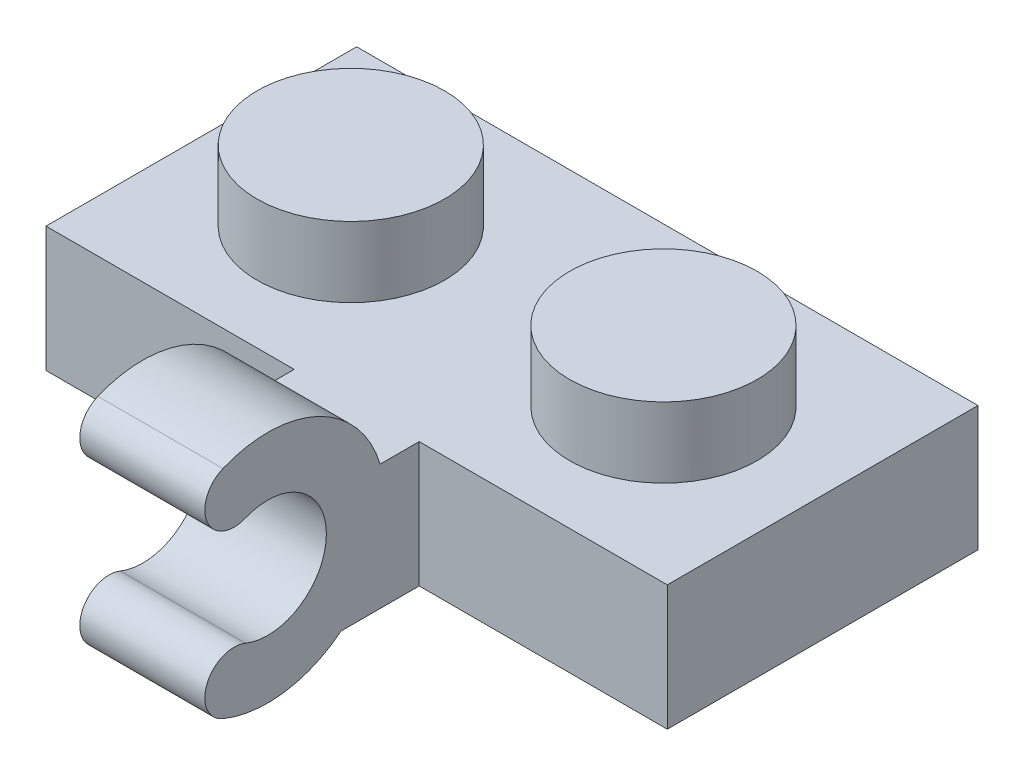
ISO-10303-21;
HEADER;
FILE_DESCRIPTION(('STEP AP214'),'2;1');
FILE_NAME('part.step','',(''),(''),'','','');
FILE_SCHEMA(('AUTOMOTIVE_DESIGN { 1 0 10303 214 1 1 1 1 }'));
ENDSEC;
DATA;
#1=APPLICATION_CONTEXT('core data for automotive mechanical design processes');
#2=APPLICATION_PROTOCOL_DEFINITION('international standard','automotive_design',2000,#1);
#3=PRODUCT_CONTEXT('',#1,'mechanical');
#4=PRODUCT('Part','Part','',(#3));
#5=PRODUCT_RELATED_PRODUCT_CATEGORY('part','',(#4));
#6=PRODUCT_DEFINITION_FORMATION('','',#4);
#7=PRODUCT_DEFINITION_CONTEXT('part definition',#1,'design');
#8=PRODUCT_DEFINITION('design','',#6,#7);
#9=PRODUCT_DEFINITION_SHAPE('','',#8);
#10=(LENGTH_UNIT() NAMED_UNIT(*) SI_UNIT(.MILLI.,.METRE.));
#11=(NAMED_UNIT(*) PLANE_ANGLE_UNIT() SI_UNIT($,.RADIAN.));
#12=(NAMED_UNIT(*) SI_UNIT($,.STERADIAN.) SOLID_ANGLE_UNIT());
#13=UNCERTAINTY_MEASURE_WITH_UNIT(LENGTH_MEASURE(1.E-05),#10,'distance_accuracy_value','');
#14=(GEOMETRIC_REPRESENTATION_CONTEXT(3) GLOBAL_UNCERTAINTY_ASSIGNED_CONTEXT((#13)) GLOBAL_UNIT_ASSIGNED_CONTEXT((#10,
#11,#12)) REPRESENTATION_CONTEXT('',''));
#15=CARTESIAN_POINT('',(0.,0.,0.));
#16=DIRECTION('',(0.,0.,1.));
#17=DIRECTION('',(1.,0.,0.));
#18=AXIS2_PLACEMENT_3D('',#15,#16,#17);
#19=CARTESIAN_POINT('',(-7.94999999999991,3.2,3.97499999999996));
#20=DIRECTION('',(0.,0.,-1.));
#21=DIRECTION('',(-1.,0.,0.));
#22=AXIS2_PLACEMENT_3D('',#19,#20,#21);
#23=PLANE('',#22);
#24=DIRECTION('',(0.,1.,0.));
#25=VECTOR('',#24,1.);
#26=CARTESIAN_POINT('',(1.6,3.2,3.97499999999996));
#27=LINE('',#26,#25);
#28=CARTESIAN_POINT('',(1.6,0.,3.97499999999996));
#29=VERTEX_POINT('',#28);
#30=CARTESIAN_POINT('',(1.6,3.2,3.97499999999996));
#31=VERTEX_POINT('',#30);
#32=EDGE_CURVE('E63',#29,#31,#27,.T.);
#33=ORIENTED_EDGE('',*,*,#32,.F.);
#34=DIRECTION('',(1.,0.,0.));
#35=VECTOR('',#34,1.);
#36=CARTESIAN_POINT('',(-7.94999999999991,0.,3.97499999999996));
#37=LINE('',#36,#35);
#38=CARTESIAN_POINT('',(7.95000000000009,0.,3.97499999999996));
#39=VERTEX_POINT('',#38);
#40=EDGE_CURVE('E325',#29,#39,#37,.T.);
#41=ORIENTED_EDGE('',*,*,#40,.T.);
#42=DIRECTION('',(0.,-1.,0.));
#43=VECTOR('',#42,1.);
#44=CARTESIAN_POINT('',(7.95000000000009,3.2,3.97499999999996));
#45=LINE('',#44,#43);
#46=CARTESIAN_POINT('',(7.95000000000009,3.2,3.97499999999996));
#47=VERTEX_POINT('',#46);
#48=EDGE_CURVE('E155',#47,#39,#45,.T.);
#49=ORIENTED_EDGE('',*,*,#48,.F.);
#50=DIRECTION('',(1.,0.,0.));
#51=VECTOR('',#50,1.);
#52=CARTESIAN_POINT('',(-7.94999999999991,3.2,3.97499999999996));
#53=LINE('',#52,#51);
#54=EDGE_CURVE('E152',#31,#47,#53,.T.);
#55=ORIENTED_EDGE('',*,*,#54,.F.);
#56=EDGE_LOOP('',(#33,#41,#49,#55));
#57=FACE_BOUND('',#56,.T.);
#58=ADVANCED_FACE('F39',(#57),#23,.F.);
#59=CARTESIAN_POINT('',(0.,0.,0.));
#60=DIRECTION('',(0.,-1.,0.));
#61=DIRECTION('',(0.,0.,-1.));
#62=AXIS2_PLACEMENT_3D('',#59,#60,#61);
#63=PLANE('',#62);
#64=DIRECTION('',(0.,0.,-1.));
#65=VECTOR('',#64,1.);
#66=CARTESIAN_POINT('',(7.95000000000009,0.,3.97499999999996));
#67=LINE('',#66,#65);
#68=CARTESIAN_POINT('',(7.95000000000009,0.,-3.97500000000002));
#69=VERTEX_POINT('',#68);
#70=EDGE_CURVE('E267',#39,#69,#67,.T.);
#71=ORIENTED_EDGE('',*,*,#70,.F.);
#72=ORIENTED_EDGE('',*,*,#40,.F.);
#73=DIRECTION('',(0.,0.,-1.));
#74=VECTOR('',#73,1.);
#75=CARTESIAN_POINT('',(1.6,0.,3.97499999999996));
#76=LINE('',#75,#74);
#77=CARTESIAN_POINT('',(1.6,0.,5.97499999999997));
#78=VERTEX_POINT('',#77);
#79=EDGE_CURVE('E176',#78,#29,#76,.T.);
#80=ORIENTED_EDGE('',*,*,#79,.F.);
#81=DIRECTION('',(-1.,0.,0.));
#82=VECTOR('',#81,1.);
#83=CARTESIAN_POINT('',(1.6,0.,5.97499999999997));
#84=LINE('',#83,#82);
#85=CARTESIAN_POINT('',(-1.6,0.,5.97499999999997));
#86=VERTEX_POINT('',#85);
#87=EDGE_CURVE('E201',#78,#86,#84,.T.);
#88=ORIENTED_EDGE('',*,*,#87,.T.);
#89=DIRECTION('',(0.,0.,-1.));
#90=VECTOR('',#89,1.);
#91=CARTESIAN_POINT('',(-1.6,0.,3.97499999999996));
#92=LINE('',#91,#90);
#93=CARTESIAN_POINT('',(-1.6,0.,3.97499999999996));
#94=VERTEX_POINT('',#93);
#95=EDGE_CURVE('E178',#86,#94,#92,.T.);
#96=ORIENTED_EDGE('',*,*,#95,.T.);
#97=CARTESIAN_POINT('',(-7.94999999999991,0.,3.97499999999996));
#98=VERTEX_POINT('',#97);
#99=EDGE_CURVE('E310',#98,#94,#37,.T.);
#100=ORIENTED_EDGE('',*,*,#99,.F.);
#101=DIRECTION('',(0.,0.,1.));
#102=VECTOR('',#101,1.);
#103=CARTESIAN_POINT('',(-7.94999999999991,0.,3.97499999999996));
#104=LINE('',#103,#102);
#105=CARTESIAN_POINT('',(-7.94999999999991,0.,-3.97500000000002));
#106=VERTEX_POINT('',#105);
#107=EDGE_CURVE('E322',#106,#98,#104,.T.);
#108=ORIENTED_EDGE('',*,*,#107,.F.);
#109=DIRECTION('',(-1.,0.,0.));
#110=VECTOR('',#109,1.);
#111=CARTESIAN_POINT('',(-7.94999999999991,0.,-3.97500000000002));
#112=LINE('',#111,#110);
#113=EDGE_CURVE('E319',#69,#106,#112,.T.);
#114=ORIENTED_EDGE('',*,*,#113,.F.);
#115=EDGE_LOOP('',(#71,#72,#80,#88,#96,#100,#108,#114));
#116=FACE_BOUND('',#115,.T.);
#117=DIRECTION('',(1.,0.,0.));
#118=VECTOR('',#117,1.);
#119=CARTESIAN_POINT('',(0.,0.,2.77499999999996));
#120=LINE('',#119,#118);
#121=CARTESIAN_POINT('',(-6.74999999999991,0.,2.77499999999996));
#122=VERTEX_POINT('',#121);
#123=CARTESIAN_POINT('',(6.75000000000009,0.,2.77499999999996));
#124=VERTEX_POINT('',#123);
#125=EDGE_CURVE('E274',#122,#124,#120,.T.);
#126=ORIENTED_EDGE('',*,*,#125,.T.);
#127=DIRECTION('',(0.,0.,-1.));
#128=VECTOR('',#127,1.);
#129=CARTESIAN_POINT('',(6.75000000000009,0.,0.));
#130=LINE('',#129,#128);
#131=CARTESIAN_POINT('',(6.75000000000009,0.,-2.77500000000002));
#132=VERTEX_POINT('',#131);
#133=EDGE_CURVE('E255',#124,#132,#130,.T.);
#134=ORIENTED_EDGE('',*,*,#133,.T.);
#135=DIRECTION('',(-1.,0.,0.));
#136=VECTOR('',#135,1.);
#137=CARTESIAN_POINT('',(0.,0.,-2.77500000000002));
#138=LINE('',#137,#136);
#139=CARTESIAN_POINT('',(-6.74999999999991,0.,-2.77500000000002));
#140=VERTEX_POINT('',#139);
#141=EDGE_CURVE('E295',#132,#140,#138,.T.);
#142=ORIENTED_EDGE('',*,*,#141,.T.);
#143=DIRECTION('',(0.,0.,1.));
#144=VECTOR('',#143,1.);
#145=CARTESIAN_POINT('',(-6.74999999999991,0.,0.));
#146=LINE('',#145,#144);
#147=EDGE_CURVE('E299',#140,#122,#146,.T.);
#148=ORIENTED_EDGE('',*,*,#147,.T.);
#149=EDGE_LOOP('',(#126,#134,#142,#148));
#150=FACE_BOUND('',#149,.T.);
#151=ADVANCED_FACE('F369',(#116,#150),#63,.T.);
#152=CARTESIAN_POINT('',(7.95000000000009,3.2,3.97499999999996));
#153=DIRECTION('',(-1.,0.,0.));
#154=DIRECTION('',(0.,0.,1.));
#155=AXIS2_PLACEMENT_3D('',#152,#153,#154);
#156=PLANE('',#155);
#157=ORIENTED_EDGE('',*,*,#70,.T.);
#158=DIRECTION('',(0.,-1.,0.));
#159=VECTOR('',#158,1.);
#160=CARTESIAN_POINT('',(7.95000000000009,3.2,-3.97500000000002));
#161=LINE('',#160,#159);
#162=CARTESIAN_POINT('',(7.95000000000009,3.2,-3.97500000000002));
#163=VERTEX_POINT('',#162);
#164=EDGE_CURVE('E338',#163,#69,#161,.T.);
#165=ORIENTED_EDGE('',*,*,#164,.F.);
#166=DIRECTION('',(0.,0.,-1.));
#167=VECTOR('',#166,1.);
#168=CARTESIAN_POINT('',(7.95000000000009,3.2,3.97499999999996));
#169=LINE('',#168,#167);
#170=EDGE_CURVE('E306',#47,#163,#169,.T.);
#171=ORIENTED_EDGE('',*,*,#170,.F.);
#172=ORIENTED_EDGE('',*,*,#48,.T.);
#173=EDGE_LOOP('',(#157,#165,#171,#172));
#174=FACE_BOUND('',#173,.T.);
#175=ADVANCED_FACE('F41',(#174),#156,.F.);
#176=CARTESIAN_POINT('',(-7.94999999999991,3.2,-3.97500000000002));
#177=DIRECTION('',(0.,0.,1.));
#178=DIRECTION('',(1.,0.,0.));
#179=AXIS2_PLACEMENT_3D('',#176,#177,#178);
#180=PLANE('',#179);
#181=ORIENTED_EDGE('',*,*,#113,.T.);
#182=DIRECTION('',(0.,-1.,0.));
#183=VECTOR('',#182,1.);
#184=CARTESIAN_POINT('',(-7.94999999999991,3.2,-3.97500000000002));
#185=LINE('',#184,#183);
#186=CARTESIAN_POINT('',(-7.94999999999991,3.2,-3.97500000000002));
#187=VERTEX_POINT('',#186);
#188=EDGE_CURVE('E334',#187,#106,#185,.T.);
#189=ORIENTED_EDGE('',*,*,#188,.F.);
#190=DIRECTION('',(-1.,0.,0.));
#191=VECTOR('',#190,1.);
#192=CARTESIAN_POINT('',(-7.94999999999991,3.2,-3.97500000000002));
#193=LINE('',#192,#191);
#194=EDGE_CURVE('E309',#163,#187,#193,.T.);
#195=ORIENTED_EDGE('',*,*,#194,.F.);
#196=ORIENTED_EDGE('',*,*,#164,.T.);
#197=EDGE_LOOP('',(#181,#189,#195,#196));
#198=FACE_BOUND('',#197,.T.);
#199=ADVANCED_FACE('F376',(#198),#180,.F.);
#200=CARTESIAN_POINT('',(-7.94999999999991,3.2,3.97499999999996));
#201=DIRECTION('',(1.,0.,0.));
#202=DIRECTION('',(0.,0.,-1.));
#203=AXIS2_PLACEMENT_3D('',#200,#201,#202);
#204=PLANE('',#203);
#205=ORIENTED_EDGE('',*,*,#107,.T.);
#206=DIRECTION('',(0.,-1.,0.));
#207=VECTOR('',#206,1.);
#208=CARTESIAN_POINT('',(-7.94999999999991,3.2,3.97499999999996));
#209=LINE('',#208,#207);
#210=CARTESIAN_POINT('',(-7.94999999999991,3.2,3.97499999999996));
#211=VERTEX_POINT('',#210);
#212=EDGE_CURVE('E330',#211,#98,#209,.T.);
#213=ORIENTED_EDGE('',*,*,#212,.F.);
#214=DIRECTION('',(0.,0.,1.));
#215=VECTOR('',#214,1.);
#216=CARTESIAN_POINT('',(-7.94999999999991,3.2,3.97499999999996));
#217=LINE('',#216,#215);
#218=EDGE_CURVE('E161',#187,#211,#217,.T.);
#219=ORIENTED_EDGE('',*,*,#218,.F.);
#220=ORIENTED_EDGE('',*,*,#188,.T.);
#221=EDGE_LOOP('',(#205,#213,#219,#220));
#222=FACE_BOUND('',#221,.T.);
#223=ADVANCED_FACE('F363',(#222),#204,.F.);
#224=ORIENTED_EDGE('',*,*,#99,.T.);
#225=DIRECTION('',(0.,1.,0.));
#226=VECTOR('',#225,1.);
#227=CARTESIAN_POINT('',(-1.6,3.2,3.97499999999996));
#228=LINE('',#227,#226);
#229=CARTESIAN_POINT('',(-1.6,3.2,3.97499999999996));
#230=VERTEX_POINT('',#229);
#231=EDGE_CURVE('E55',#94,#230,#228,.T.);
#232=ORIENTED_EDGE('',*,*,#231,.T.);
#233=EDGE_CURVE('E160',#211,#230,#53,.T.);
#234=ORIENTED_EDGE('',*,*,#233,.F.);
#235=ORIENTED_EDGE('',*,*,#212,.T.);
#236=EDGE_LOOP('',(#224,#232,#234,#235));
#237=FACE_BOUND('',#236,.T.);
#238=ADVANCED_FACE('F353',(#237),#23,.F.);
#239=CARTESIAN_POINT('',(0.,3.2,0.));
#240=DIRECTION('',(0.,-1.,0.));
#241=DIRECTION('',(0.,0.,-1.));
#242=AXIS2_PLACEMENT_3D('',#239,#240,#241);
#243=PLANE('',#242);
#244=CARTESIAN_POINT('',(3.95000000000009,3.2,0.0749999999999648));
#245=DIRECTION('',(0.,-1.,0.));
#246=DIRECTION('',(0.,0.,-1.));
#247=AXIS2_PLACEMENT_3D('',#244,#245,#246);
#248=CIRCLE('',#247,2.4);
#249=CARTESIAN_POINT('',(3.95000000000009,3.2,-2.32500000000003));
#250=VERTEX_POINT('',#249);
#251=EDGE_CURVE('E11',#250,#250,#248,.F.);
#252=ORIENTED_EDGE('',*,*,#251,.F.);
#253=EDGE_LOOP('',(#252));
#254=FACE_BOUND('',#253,.T.);
#255=CARTESIAN_POINT('',(-4.04999999999991,3.2,0.0749999999999648));
#256=DIRECTION('',(0.,-1.,0.));
#257=DIRECTION('',(0.,0.,-1.));
#258=AXIS2_PLACEMENT_3D('',#255,#256,#257);
#259=CIRCLE('',#258,2.4);
#260=CARTESIAN_POINT('',(-4.04999999999991,3.2,-2.32500000000003));
#261=VERTEX_POINT('',#260);
#262=EDGE_CURVE('E48',#261,#261,#259,.F.);
#263=ORIENTED_EDGE('',*,*,#262,.F.);
#264=EDGE_LOOP('',(#263));
#265=FACE_BOUND('',#264,.T.);
#266=ORIENTED_EDGE('',*,*,#170,.T.);
#267=ORIENTED_EDGE('',*,*,#194,.T.);
#268=ORIENTED_EDGE('',*,*,#218,.T.);
#269=ORIENTED_EDGE('',*,*,#233,.T.);
#270=DIRECTION('',(0.,0.,1.));
#271=VECTOR('',#270,1.);
#272=CARTESIAN_POINT('',(-1.6,3.2,3.97499999999996));
#273=LINE('',#272,#271);
#274=CARTESIAN_POINT('',(-1.6,3.2,4.97499999999996));
#275=VERTEX_POINT('',#274);
#276=EDGE_CURVE('E204',#230,#275,#273,.T.);
#277=ORIENTED_EDGE('',*,*,#276,.T.);
#278=DIRECTION('',(-1.,0.,0.));
#279=VECTOR('',#278,1.);
#280=CARTESIAN_POINT('',(1.6,3.2,4.97499999999996));
#281=LINE('',#280,#279);
#282=CARTESIAN_POINT('',(1.6,3.2,4.97499999999996));
#283=VERTEX_POINT('',#282);
#284=EDGE_CURVE('E167',#283,#275,#281,.T.);
#285=ORIENTED_EDGE('',*,*,#284,.F.);
#286=DIRECTION('',(0.,0.,1.));
#287=VECTOR('',#286,1.);
#288=CARTESIAN_POINT('',(1.6,3.2,3.97499999999996));
#289=LINE('',#288,#287);
#290=EDGE_CURVE('E164',#31,#283,#289,.T.);
#291=ORIENTED_EDGE('',*,*,#290,.F.);
#292=ORIENTED_EDGE('',*,*,#54,.T.);
#293=EDGE_LOOP('',(#266,#267,#268,#269,#277,#285,#291,#292));
#294=FACE_BOUND('',#293,.T.);
#295=ADVANCED_FACE('F165',(#254,#265,#294),#243,.F.);
#296=CARTESIAN_POINT('',(6.75000000000009,3.2,3.97499999999996));
#297=DIRECTION('',(-1.,0.,0.));
#298=DIRECTION('',(0.,0.,1.));
#299=AXIS2_PLACEMENT_3D('',#296,#297,#298);
#300=PLANE('',#299);
#301=ORIENTED_EDGE('',*,*,#133,.F.);
#302=DIRECTION('',(0.,-1.,0.));
#303=VECTOR('',#302,1.);
#304=CARTESIAN_POINT('',(6.75000000000009,3.2,2.77499999999996));
#305=LINE('',#304,#303);
#306=CARTESIAN_POINT('',(6.75000000000009,2.,2.77499999999996));
#307=VERTEX_POINT('',#306);
#308=EDGE_CURVE('E275',#307,#124,#305,.T.);
#309=ORIENTED_EDGE('',*,*,#308,.F.);
#310=DIRECTION('',(0.,0.,-1.));
#311=VECTOR('',#310,1.);
#312=CARTESIAN_POINT('',(6.75000000000009,2.,0.));
#313=LINE('',#312,#311);
#314=CARTESIAN_POINT('',(6.75000000000009,2.,-2.77500000000002));
#315=VERTEX_POINT('',#314);
#316=EDGE_CURVE('E269',#307,#315,#313,.T.);
#317=ORIENTED_EDGE('',*,*,#316,.T.);
#318=DIRECTION('',(0.,-1.,0.));
#319=VECTOR('',#318,1.);
#320=CARTESIAN_POINT('',(6.75000000000009,3.2,-2.77500000000002));
#321=LINE('',#320,#319);
#322=EDGE_CURVE('E263',#315,#132,#321,.T.);
#323=ORIENTED_EDGE('',*,*,#322,.T.);
#324=EDGE_LOOP('',(#301,#309,#317,#323));
#325=FACE_BOUND('',#324,.T.);
#326=ADVANCED_FACE('F352',(#325),#300,.T.);
#327=CARTESIAN_POINT('',(-7.94999999999991,3.2,-2.77500000000002));
#328=DIRECTION('',(0.,0.,1.));
#329=DIRECTION('',(1.,0.,0.));
#330=AXIS2_PLACEMENT_3D('',#327,#328,#329);
#331=PLANE('',#330);
#332=ORIENTED_EDGE('',*,*,#141,.F.);
#333=ORIENTED_EDGE('',*,*,#322,.F.);
#334=DIRECTION('',(-1.,0.,0.));
#335=VECTOR('',#334,1.);
#336=CARTESIAN_POINT('',(0.,2.,-2.77500000000002));
#337=LINE('',#336,#335);
#338=CARTESIAN_POINT('',(-6.74999999999991,2.,-2.77500000000002));
#339=VERTEX_POINT('',#338);
#340=EDGE_CURVE('E273',#315,#339,#337,.T.);
#341=ORIENTED_EDGE('',*,*,#340,.T.);
#342=DIRECTION('',(0.,-1.,0.));
#343=VECTOR('',#342,1.);
#344=CARTESIAN_POINT('',(-6.74999999999991,3.2,-2.77500000000002));
#345=LINE('',#344,#343);
#346=EDGE_CURVE('E268',#339,#140,#345,.T.);
#347=ORIENTED_EDGE('',*,*,#346,.T.);
#348=EDGE_LOOP('',(#332,#333,#341,#347));
#349=FACE_BOUND('',#348,.T.);
#350=ADVANCED_FACE('F360',(#349),#331,.T.);
#351=CARTESIAN_POINT('',(-6.74999999999991,3.2,3.97499999999996));
#352=DIRECTION('',(1.,0.,0.));
#353=DIRECTION('',(0.,0.,-1.));
#354=AXIS2_PLACEMENT_3D('',#351,#352,#353);
#355=PLANE('',#354);
#356=ORIENTED_EDGE('',*,*,#147,.F.);
#357=ORIENTED_EDGE('',*,*,#346,.F.);
#358=DIRECTION('',(0.,0.,1.));
#359=VECTOR('',#358,1.);
#360=CARTESIAN_POINT('',(-6.74999999999991,2.,0.));
#361=LINE('',#360,#359);
#362=CARTESIAN_POINT('',(-6.74999999999991,2.,2.77499999999996));
#363=VERTEX_POINT('',#362);
#364=EDGE_CURVE('E285',#339,#363,#361,.T.);
#365=ORIENTED_EDGE('',*,*,#364,.T.);
#366=DIRECTION('',(0.,-1.,0.));
#367=VECTOR('',#366,1.);
#368=CARTESIAN_POINT('',(-6.74999999999991,3.2,2.77499999999996));
#369=LINE('',#368,#367);
#370=EDGE_CURVE('E278',#363,#122,#369,.T.);
#371=ORIENTED_EDGE('',*,*,#370,.T.);
#372=EDGE_LOOP('',(#356,#357,#365,#371));
#373=FACE_BOUND('',#372,.T.);
#374=ADVANCED_FACE('F468',(#373),#355,.T.);
#375=CARTESIAN_POINT('',(-7.94999999999991,3.2,2.77499999999996));
#376=DIRECTION('',(0.,0.,-1.));
#377=DIRECTION('',(-1.,0.,0.));
#378=AXIS2_PLACEMENT_3D('',#375,#376,#377);
#379=PLANE('',#378);
#380=ORIENTED_EDGE('',*,*,#125,.F.);
#381=ORIENTED_EDGE('',*,*,#370,.F.);
#382=DIRECTION('',(1.,0.,0.));
#383=VECTOR('',#382,1.);
#384=CARTESIAN_POINT('',(0.,2.,2.77499999999996));
#385=LINE('',#384,#383);
#386=EDGE_CURVE('E279',#363,#307,#385,.T.);
#387=ORIENTED_EDGE('',*,*,#386,.T.);
#388=ORIENTED_EDGE('',*,*,#308,.T.);
#389=EDGE_LOOP('',(#380,#381,#387,#388));
#390=FACE_BOUND('',#389,.T.);
#391=ADVANCED_FACE('F472',(#390),#379,.T.);
#392=CARTESIAN_POINT('',(0.,2.,0.));
#393=DIRECTION('',(0.,-1.,0.));
#394=DIRECTION('',(0.,0.,-1.));
#395=AXIS2_PLACEMENT_3D('',#392,#393,#394);
#396=PLANE('',#395);
#397=CARTESIAN_POINT('',(0.,2.,0.));
#398=DIRECTION('',(0.,-1.,0.));
#399=DIRECTION('',(0.,0.,-1.));
#400=AXIS2_PLACEMENT_3D('',#397,#398,#399);
#401=CIRCLE('',#400,1.5);
#402=CARTESIAN_POINT('',(0.,2.,-1.5));
#403=VERTEX_POINT('',#402);
#404=EDGE_CURVE('E256',#403,#403,#401,.T.);
#405=ORIENTED_EDGE('',*,*,#404,.F.);
#406=EDGE_LOOP('',(#405));
#407=FACE_BOUND('',#406,.T.);
#408=ORIENTED_EDGE('',*,*,#316,.F.);
#409=ORIENTED_EDGE('',*,*,#386,.F.);
#410=ORIENTED_EDGE('',*,*,#364,.F.);
#411=ORIENTED_EDGE('',*,*,#340,.F.);
#412=EDGE_LOOP('',(#408,#409,#410,#411));
#413=FACE_BOUND('',#412,.T.);
#414=ADVANCED_FACE('F463',(#407,#413),#396,.T.);
#415=CARTESIAN_POINT('',(0.,-4.24264068711929,0.));
#416=DIRECTION('',(0.,1.,0.));
#417=DIRECTION('',(0.,0.,1.));
#418=AXIS2_PLACEMENT_3D('',#415,#416,#417);
#419=CYLINDRICAL_SURFACE('',#418,1.5);
#420=ORIENTED_EDGE('',*,*,#404,.T.);
#421=EDGE_LOOP('',(#420));
#422=FACE_BOUND('',#421,.T.);
#423=CARTESIAN_POINT('',(0.,0.,0.));
#424=DIRECTION('',(0.,-1.,0.));
#425=DIRECTION('',(0.,0.,-1.));
#426=AXIS2_PLACEMENT_3D('',#423,#424,#425);
#427=CIRCLE('',#426,1.5);
#428=CARTESIAN_POINT('',(0.,0.,-1.5));
#429=VERTEX_POINT('',#428);
#430=EDGE_CURVE('E251',#429,#429,#427,.T.);
#431=ORIENTED_EDGE('',*,*,#430,.F.);
#432=EDGE_LOOP('',(#431));
#433=FACE_BOUND('',#432,.T.);
#434=ADVANCED_FACE('F460',(#422,#433),#419,.T.);
#435=CARTESIAN_POINT('',(0.,-4.24264068711929,0.));
#436=DIRECTION('',(0.,1.,0.));
#437=DIRECTION('',(0.,0.,1.));
#438=AXIS2_PLACEMENT_3D('',#435,#436,#437);
#439=CYLINDRICAL_SURFACE('',#438,0.5);
#440=CARTESIAN_POINT('',(0.,2.,0.));
#441=DIRECTION('',(0.,-1.,0.));
#442=DIRECTION('',(0.,0.,-1.));
#443=AXIS2_PLACEMENT_3D('',#440,#441,#442);
#444=CIRCLE('',#443,0.5);
#445=CARTESIAN_POINT('',(0.,2.,-0.5));
#446=VERTEX_POINT('',#445);
#447=EDGE_CURVE('E342',#446,#446,#444,.F.);
#448=ORIENTED_EDGE('',*,*,#447,.T.);
#449=EDGE_LOOP('',(#448));
#450=FACE_BOUND('',#449,.T.);
#451=CARTESIAN_POINT('',(0.,0.,0.));
#452=DIRECTION('',(0.,-1.,0.));
#453=DIRECTION('',(0.,0.,-1.));
#454=AXIS2_PLACEMENT_3D('',#451,#452,#453);
#455=CIRCLE('',#454,0.5);
#456=CARTESIAN_POINT('',(0.,0.,-0.5));
#457=VERTEX_POINT('',#456);
#458=EDGE_CURVE('E250',#457,#457,#455,.T.);
#459=ORIENTED_EDGE('',*,*,#458,.T.);
#460=EDGE_LOOP('',(#459));
#461=FACE_BOUND('',#460,.T.);
#462=ADVANCED_FACE('F456',(#450,#461),#439,.F.);
#463=CARTESIAN_POINT('',(0.,0.,0.));
#464=DIRECTION('',(0.,-1.,0.));
#465=DIRECTION('',(0.,0.,-1.));
#466=AXIS2_PLACEMENT_3D('',#463,#464,#465);
#467=PLANE('',#466);
#468=ORIENTED_EDGE('',*,*,#458,.F.);
#469=EDGE_LOOP('',(#468));
#470=FACE_BOUND('',#469,.T.);
#471=ORIENTED_EDGE('',*,*,#430,.T.);
#472=EDGE_LOOP('',(#471));
#473=FACE_BOUND('',#472,.T.);
#474=ADVANCED_FACE('F453',(#470,#473),#467,.T.);
#475=ORIENTED_EDGE('',*,*,#447,.F.);
#476=EDGE_LOOP('',(#475));
#477=FACE_BOUND('',#476,.T.);
#478=ADVANCED_FACE('F451',(#477),#396,.T.);
#479=CARTESIAN_POINT('',(-4.04999999999991,5.,0.0749999999999648));
#480=DIRECTION('',(0.,-1.,0.));
#481=DIRECTION('',(0.,0.,-1.));
#482=AXIS2_PLACEMENT_3D('',#479,#480,#481);
#483=CYLINDRICAL_SURFACE('',#482,2.4);
#484=CARTESIAN_POINT('',(-4.04999999999991,5.,0.0749999999999648));
#485=DIRECTION('',(0.,1.,0.));
#486=DIRECTION('',(0.,0.,1.));
#487=AXIS2_PLACEMENT_3D('',#484,#485,#486);
#488=CIRCLE('',#487,2.4);
#489=CARTESIAN_POINT('',(-4.04999999999991,5.,2.47499999999996));
#490=VERTEX_POINT('',#489);
#491=EDGE_CURVE('E246',#490,#490,#488,.T.);
#492=ORIENTED_EDGE('',*,*,#491,.F.);
#493=EDGE_LOOP('',(#492));
#494=FACE_BOUND('',#493,.T.);
#495=ORIENTED_EDGE('',*,*,#262,.T.);
#496=EDGE_LOOP('',(#495));
#497=FACE_BOUND('',#496,.T.);
#498=ADVANCED_FACE('F349',(#494,#497),#483,.T.);
#499=CARTESIAN_POINT('',(-4.04999999999991,5.,0.0749999999999648));
#500=DIRECTION('',(0.,1.,0.));
#501=DIRECTION('',(0.,0.,1.));
#502=AXIS2_PLACEMENT_3D('',#499,#500,#501);
#503=PLANE('',#502);
#504=ORIENTED_EDGE('',*,*,#491,.T.);
#505=EDGE_LOOP('',(#504));
#506=FACE_BOUND('',#505,.T.);
#507=ADVANCED_FACE('F444',(#506),#503,.T.);
#508=CARTESIAN_POINT('',(3.95000000000009,5.,0.0749999999999648));
#509=DIRECTION('',(0.,-1.,0.));
#510=DIRECTION('',(0.,0.,-1.));
#511=AXIS2_PLACEMENT_3D('',#508,#509,#510);
#512=CYLINDRICAL_SURFACE('',#511,2.4);
#513=CARTESIAN_POINT('',(3.95000000000009,5.,0.0749999999999648));
#514=DIRECTION('',(0.,1.,0.));
#515=DIRECTION('',(0.,0.,1.));
#516=AXIS2_PLACEMENT_3D('',#513,#514,#515);
#517=CIRCLE('',#516,2.4);
#518=CARTESIAN_POINT('',(3.95000000000009,5.,2.47499999999996));
#519=VERTEX_POINT('',#518);
#520=EDGE_CURVE('E242',#519,#519,#517,.T.);
#521=ORIENTED_EDGE('',*,*,#520,.F.);
#522=EDGE_LOOP('',(#521));
#523=FACE_BOUND('',#522,.T.);
#524=ORIENTED_EDGE('',*,*,#251,.T.);
#525=EDGE_LOOP('',(#524));
#526=FACE_BOUND('',#525,.T.);
#527=ADVANCED_FACE('F440',(#523,#526),#512,.T.);
#528=CARTESIAN_POINT('',(3.95000000000009,5.,0.0749999999999648));
#529=DIRECTION('',(0.,1.,0.));
#530=DIRECTION('',(0.,0.,1.));
#531=AXIS2_PLACEMENT_3D('',#528,#529,#530);
#532=PLANE('',#531);
#533=ORIENTED_EDGE('',*,*,#520,.T.);
#534=EDGE_LOOP('',(#533));
#535=FACE_BOUND('',#534,.T.);
#536=ADVANCED_FACE('F437',(#535),#532,.T.);
#537=CARTESIAN_POINT('',(1.6,2.34209955111982,7.8497185635834));
#538=DIRECTION('',(-1.,0.,0.));
#539=DIRECTION('',(0.,0.,1.));
#540=AXIS2_PLACEMENT_3D('',#537,#538,#539);
#541=CYLINDRICAL_SURFACE('',#540,3.);
#542=CARTESIAN_POINT('',(-1.6,2.34209955111982,7.8497185635834));
#543=DIRECTION('',(1.,0.,0.));
#544=DIRECTION('',(0.,0.,-1.));
#545=AXIS2_PLACEMENT_3D('',#542,#543,#544);
#546=CIRCLE('',#545,3.);
#547=CARTESIAN_POINT('',(-1.6,5.11373814865369,8.99776886067865));
#548=VERTEX_POINT('',#547);
#549=EDGE_CURVE('E207',#275,#548,#546,.T.);
#550=ORIENTED_EDGE('',*,*,#549,.T.);
#551=DIRECTION('',(-1.,0.,0.));
#552=VECTOR('',#551,1.);
#553=CARTESIAN_POINT('',(1.6,5.11373814865369,8.99776886067865));
#554=LINE('',#553,#552);
#555=CARTESIAN_POINT('',(1.6,5.11373814865369,8.99776886067865));
#556=VERTEX_POINT('',#555);
#557=EDGE_CURVE('E236',#556,#548,#554,.T.);
#558=ORIENTED_EDGE('',*,*,#557,.F.);
#559=CARTESIAN_POINT('',(1.6,2.34209955111982,7.8497185635834));
#560=DIRECTION('',(1.,0.,0.));
#561=DIRECTION('',(0.,0.,-1.));
#562=AXIS2_PLACEMENT_3D('',#559,#560,#561);
#563=CIRCLE('',#562,3.);
#564=EDGE_CURVE('E171',#283,#556,#563,.T.);
#565=ORIENTED_EDGE('',*,*,#564,.F.);
#566=ORIENTED_EDGE('',*,*,#284,.T.);
#567=EDGE_LOOP('',(#550,#558,#565,#566));
#568=FACE_BOUND('',#567,.T.);
#569=ADVANCED_FACE('F401',(#568),#541,.T.);
#570=CARTESIAN_POINT('',(1.6,4.42082849927022,8.71075628640484));
#571=DIRECTION('',(-1.,0.,0.));
#572=DIRECTION('',(0.,0.,1.));
#573=AXIS2_PLACEMENT_3D('',#570,#571,#572);
#574=CYLINDRICAL_SURFACE('',#573,0.75);
#575=CARTESIAN_POINT('',(-1.6,4.42082849927022,8.71075628640484));
#576=DIRECTION('',(1.,0.,0.));
#577=DIRECTION('',(0.,0.,-1.));
#578=AXIS2_PLACEMENT_3D('',#575,#576,#577);
#579=CIRCLE('',#578,0.75);
#580=CARTESIAN_POINT('',(-1.6,3.72791884988675,8.42374371213103));
#581=VERTEX_POINT('',#580);
#582=EDGE_CURVE('E210',#548,#581,#579,.T.);
#583=ORIENTED_EDGE('',*,*,#582,.T.);
#584=DIRECTION('',(-1.,0.,0.));
#585=VECTOR('',#584,1.);
#586=CARTESIAN_POINT('',(1.6,3.72791884988675,8.42374371213103));
#587=LINE('',#586,#585);
#588=CARTESIAN_POINT('',(1.6,3.72791884988675,8.42374371213103));
#589=VERTEX_POINT('',#588);
#590=EDGE_CURVE('E232',#589,#581,#587,.T.);
#591=ORIENTED_EDGE('',*,*,#590,.F.);
#592=CARTESIAN_POINT('',(1.6,4.42082849927022,8.71075628640484));
#593=DIRECTION('',(1.,0.,0.));
#594=DIRECTION('',(0.,0.,-1.));
#595=AXIS2_PLACEMENT_3D('',#592,#593,#594);
#596=CIRCLE('',#595,0.75);
#597=EDGE_CURVE('E187',#556,#589,#596,.T.);
#598=ORIENTED_EDGE('',*,*,#597,.F.);
#599=ORIENTED_EDGE('',*,*,#557,.T.);
#600=EDGE_LOOP('',(#583,#591,#598,#599));
#601=FACE_BOUND('',#600,.T.);
#602=ADVANCED_FACE('F404',(#601),#574,.T.);
#603=CARTESIAN_POINT('',(1.6,2.34209955111982,7.8497185635834));
#604=DIRECTION('',(-1.,0.,0.));
#605=DIRECTION('',(0.,0.,1.));
#606=AXIS2_PLACEMENT_3D('',#603,#604,#605);
#607=CYLINDRICAL_SURFACE('',#606,1.5);
#608=CARTESIAN_POINT('',(-1.6,2.34209955111982,7.8497185635834));
#609=DIRECTION('',(-1.,0.,0.));
#610=DIRECTION('',(0.,0.,-1.));
#611=AXIS2_PLACEMENT_3D('',#608,#609,#610);
#612=CIRCLE('',#611,1.5);
#613=CARTESIAN_POINT('',(-1.6,0.95628025235289,8.42374371213102));
#614=VERTEX_POINT('',#613);
#615=EDGE_CURVE('E213',#581,#614,#612,.T.);
#616=ORIENTED_EDGE('',*,*,#615,.T.);
#617=DIRECTION('',(-1.,0.,0.));
#618=VECTOR('',#617,1.);
#619=CARTESIAN_POINT('',(1.6,0.95628025235289,8.42374371213102));
#620=LINE('',#619,#618);
#621=CARTESIAN_POINT('',(1.6,0.95628025235289,8.42374371213102));
#622=VERTEX_POINT('',#621);
#623=EDGE_CURVE('E228',#622,#614,#620,.T.);
#624=ORIENTED_EDGE('',*,*,#623,.F.);
#625=CARTESIAN_POINT('',(1.6,2.34209955111982,7.8497185635834));
#626=DIRECTION('',(-1.,0.,0.));
#627=DIRECTION('',(0.,0.,-1.));
#628=AXIS2_PLACEMENT_3D('',#625,#626,#627);
#629=CIRCLE('',#628,1.5);
#630=EDGE_CURVE('E190',#589,#622,#629,.T.);
#631=ORIENTED_EDGE('',*,*,#630,.F.);
#632=ORIENTED_EDGE('',*,*,#590,.T.);
#633=EDGE_LOOP('',(#616,#624,#631,#632));
#634=FACE_BOUND('',#633,.T.);
#635=ADVANCED_FACE('F411',(#634),#607,.F.);
#636=CARTESIAN_POINT('',(1.6,0.263370602969423,8.71075628640484));
#637=DIRECTION('',(-1.,0.,0.));
#638=DIRECTION('',(0.,0.,1.));
#639=AXIS2_PLACEMENT_3D('',#636,#637,#638);
#640=CYLINDRICAL_SURFACE('',#639,0.750000000000001);
#641=CARTESIAN_POINT('',(-1.6,0.263370602969423,8.71075628640484));
#642=DIRECTION('',(1.,0.,0.));
#643=DIRECTION('',(0.,0.,1.));
#644=AXIS2_PLACEMENT_3D('',#641,#642,#643);
#645=CIRCLE('',#644,0.750000000000001);
#646=CARTESIAN_POINT('',(-1.6,-0.429539046414042,8.99776886067866));
#647=VERTEX_POINT('',#646);
#648=EDGE_CURVE('E216',#614,#647,#645,.T.);
#649=ORIENTED_EDGE('',*,*,#648,.T.);
#650=DIRECTION('',(-1.,0.,0.));
#651=VECTOR('',#650,1.);
#652=CARTESIAN_POINT('',(1.6,-0.429539046414042,8.99776886067866));
#653=LINE('',#652,#651);
#654=CARTESIAN_POINT('',(1.6,-0.429539046414042,8.99776886067866));
#655=VERTEX_POINT('',#654);
#656=EDGE_CURVE('E224',#655,#647,#653,.T.);
#657=ORIENTED_EDGE('',*,*,#656,.F.);
#658=CARTESIAN_POINT('',(1.6,0.263370602969423,8.71075628640484));
#659=DIRECTION('',(1.,0.,0.));
#660=DIRECTION('',(0.,0.,1.));
#661=AXIS2_PLACEMENT_3D('',#658,#659,#660);
#662=CIRCLE('',#661,0.750000000000001);
#663=EDGE_CURVE('E193',#622,#655,#662,.T.);
#664=ORIENTED_EDGE('',*,*,#663,.F.);
#665=ORIENTED_EDGE('',*,*,#623,.T.);
#666=EDGE_LOOP('',(#649,#657,#664,#665));
#667=FACE_BOUND('',#666,.T.);
#668=ADVANCED_FACE('F414',(#667),#640,.T.);
#669=CARTESIAN_POINT('',(1.6,2.34209955111982,7.8497185635834));
#670=DIRECTION('',(-1.,0.,0.));
#671=DIRECTION('',(0.,0.,1.));
#672=AXIS2_PLACEMENT_3D('',#669,#670,#671);
#673=CYLINDRICAL_SURFACE('',#672,3.);
#674=CARTESIAN_POINT('',(-1.6,2.34209955111982,7.8497185635834));
#675=DIRECTION('',(1.,0.,0.));
#676=DIRECTION('',(0.,0.,-1.));
#677=AXIS2_PLACEMENT_3D('',#674,#675,#676);
#678=CIRCLE('',#677,3.);
#679=EDGE_CURVE('E182',#647,#86,#678,.T.);
#680=ORIENTED_EDGE('',*,*,#679,.T.);
#681=ORIENTED_EDGE('',*,*,#87,.F.);
#682=CARTESIAN_POINT('',(1.6,2.34209955111982,7.8497185635834));
#683=DIRECTION('',(1.,0.,0.));
#684=DIRECTION('',(0.,0.,-1.));
#685=AXIS2_PLACEMENT_3D('',#682,#683,#684);
#686=CIRCLE('',#685,3.);
#687=EDGE_CURVE('E196',#655,#78,#686,.T.);
#688=ORIENTED_EDGE('',*,*,#687,.F.);
#689=ORIENTED_EDGE('',*,*,#656,.T.);
#690=EDGE_LOOP('',(#680,#681,#688,#689));
#691=FACE_BOUND('',#690,.T.);
#692=ADVANCED_FACE('F419',(#691),#673,.T.);
#693=CARTESIAN_POINT('',(1.6,2.34209955111982,7.8497185635834));
#694=DIRECTION('',(1.,0.,0.));
#695=DIRECTION('',(0.,0.,-1.));
#696=AXIS2_PLACEMENT_3D('',#693,#694,#695);
#697=PLANE('',#696);
#698=ORIENTED_EDGE('',*,*,#32,.T.);
#699=ORIENTED_EDGE('',*,*,#290,.T.);
#700=ORIENTED_EDGE('',*,*,#564,.T.);
#701=ORIENTED_EDGE('',*,*,#597,.T.);
#702=ORIENTED_EDGE('',*,*,#630,.T.);
#703=ORIENTED_EDGE('',*,*,#663,.T.);
#704=ORIENTED_EDGE('',*,*,#687,.T.);
#705=ORIENTED_EDGE('',*,*,#79,.T.);
#706=EDGE_LOOP('',(#698,#699,#700,#701,#702,#703,#704,#705));
#707=FACE_BOUND('',#706,.T.);
#708=ADVANCED_FACE('F174',(#707),#697,.T.);
#709=CARTESIAN_POINT('',(-1.6,2.34209955111982,7.8497185635834));
#710=DIRECTION('',(1.,0.,0.));
#711=DIRECTION('',(0.,0.,-1.));
#712=AXIS2_PLACEMENT_3D('',#709,#710,#711);
#713=PLANE('',#712);
#714=ORIENTED_EDGE('',*,*,#231,.F.);
#715=ORIENTED_EDGE('',*,*,#95,.F.);
#716=ORIENTED_EDGE('',*,*,#679,.F.);
#717=ORIENTED_EDGE('',*,*,#648,.F.);
#718=ORIENTED_EDGE('',*,*,#615,.F.);
#719=ORIENTED_EDGE('',*,*,#582,.F.);
#720=ORIENTED_EDGE('',*,*,#549,.F.);
#721=ORIENTED_EDGE('',*,*,#276,.F.);
#722=EDGE_LOOP('',(#714,#715,#716,#717,#718,#719,#720,#721));
#723=FACE_BOUND('',#722,.T.);
#724=ADVANCED_FACE('F396',(#723),#713,.F.);
#725=CLOSED_SHELL('',(#58,#151,#175,#199,#223,#238,#295,#326,#350,#374,#391,#414,#434,#462,#474,
#478,#498,#507,#527,#536,#569,#602,#635,#668,#692,#708,#724));
#726=MANIFOLD_SOLID_BREP('B2',#725);
#727=ADVANCED_BREP_SHAPE_REPRESENTATION('',(#18,#726),#14);
#728=SHAPE_DEFINITION_REPRESENTATION(#9,#727);
ENDSEC;
END-ISO-10303-21;
